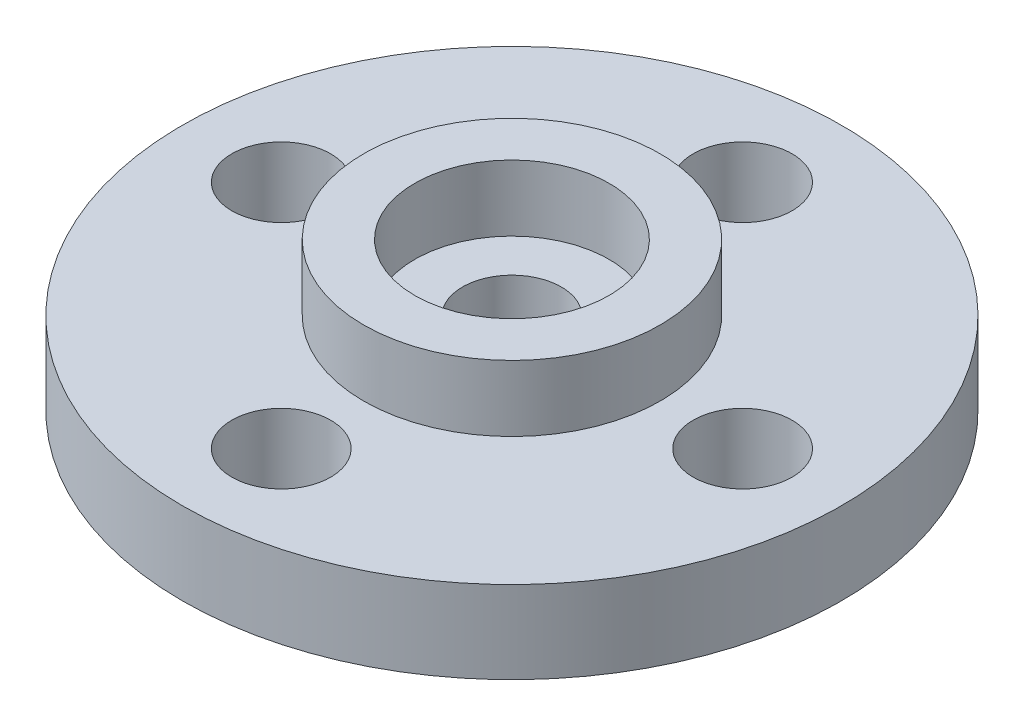
ISO-10303-21;
HEADER;
FILE_DESCRIPTION(('STEP AP214'),'2;1');
FILE_NAME('part.step','',(''),(''),'','','');
FILE_SCHEMA(('AUTOMOTIVE_DESIGN { 1 0 10303 214 1 1 1 1 }'));
ENDSEC;
DATA;
#1=APPLICATION_CONTEXT('core data for automotive mechanical design processes');
#2=APPLICATION_PROTOCOL_DEFINITION('international standard','automotive_design',2000,#1);
#3=PRODUCT_CONTEXT('',#1,'mechanical');
#4=PRODUCT('Part','Part','',(#3));
#5=PRODUCT_RELATED_PRODUCT_CATEGORY('part','',(#4));
#6=PRODUCT_DEFINITION_FORMATION('','',#4);
#7=PRODUCT_DEFINITION_CONTEXT('part definition',#1,'design');
#8=PRODUCT_DEFINITION('design','',#6,#7);
#9=PRODUCT_DEFINITION_SHAPE('','',#8);
#10=(LENGTH_UNIT() NAMED_UNIT(*) SI_UNIT(.MILLI.,.METRE.));
#11=(NAMED_UNIT(*) PLANE_ANGLE_UNIT() SI_UNIT($,.RADIAN.));
#12=(NAMED_UNIT(*) SI_UNIT($,.STERADIAN.) SOLID_ANGLE_UNIT());
#13=UNCERTAINTY_MEASURE_WITH_UNIT(LENGTH_MEASURE(1.E-05),#10,'distance_accuracy_value','');
#14=(GEOMETRIC_REPRESENTATION_CONTEXT(3) GLOBAL_UNCERTAINTY_ASSIGNED_CONTEXT((#13)) GLOBAL_UNIT_ASSIGNED_CONTEXT((#10,
#11,#12)) REPRESENTATION_CONTEXT('',''));
#15=CARTESIAN_POINT('',(0.,0.,0.));
#16=DIRECTION('',(0.,0.,1.));
#17=DIRECTION('',(1.,0.,0.));
#18=AXIS2_PLACEMENT_3D('',#15,#16,#17);
#19=CARTESIAN_POINT('',(0.,2.5,0.));
#20=DIRECTION('',(0.,1.,0.));
#21=DIRECTION('',(0.,0.,1.));
#22=AXIS2_PLACEMENT_3D('',#19,#20,#21);
#23=PLANE('',#22);
#24=CARTESIAN_POINT('',(0.,2.5,0.));
#25=DIRECTION('',(0.,1.,0.));
#26=DIRECTION('',(0.,0.,1.));
#27=AXIS2_PLACEMENT_3D('',#24,#25,#26);
#28=CIRCLE('',#27,1.5);
#29=CARTESIAN_POINT('',(0.,2.5,1.5));
#30=VERTEX_POINT('',#29);
#31=EDGE_CURVE('E53',#30,#30,#28,.T.);
#32=ORIENTED_EDGE('',*,*,#31,.F.);
#33=EDGE_LOOP('',(#32));
#34=FACE_BOUND('',#33,.T.);
#35=CARTESIAN_POINT('',(0.,2.5,0.));
#36=DIRECTION('',(0.,1.,0.));
#37=DIRECTION('',(0.,0.,1.));
#38=AXIS2_PLACEMENT_3D('',#35,#36,#37);
#39=CIRCLE('',#38,2.95);
#40=CARTESIAN_POINT('',(0.,2.5,2.95));
#41=VERTEX_POINT('',#40);
#42=EDGE_CURVE('E10',#41,#41,#39,.F.);
#43=ORIENTED_EDGE('',*,*,#42,.F.);
#44=EDGE_LOOP('',(#43));
#45=FACE_BOUND('',#44,.T.);
#46=ADVANCED_FACE('F37',(#34,#45),#23,.T.);
#47=CARTESIAN_POINT('',(0.,2.5,0.));
#48=DIRECTION('',(0.,1.,0.));
#49=DIRECTION('',(0.,0.,1.));
#50=AXIS2_PLACEMENT_3D('',#47,#48,#49);
#51=CIRCLE('',#50,4.5);
#52=CARTESIAN_POINT('',(0.,2.5,4.5));
#53=VERTEX_POINT('',#52);
#54=EDGE_CURVE('E85',#53,#53,#51,.T.);
#55=ORIENTED_EDGE('',*,*,#54,.F.);
#56=EDGE_LOOP('',(#55));
#57=FACE_BOUND('',#56,.T.);
#58=CARTESIAN_POINT('',(0.,2.5,7.00000000000009));
#59=DIRECTION('',(0.,1.,0.));
#60=DIRECTION('',(0.,0.,1.));
#61=AXIS2_PLACEMENT_3D('',#58,#59,#60);
#62=CIRCLE('',#61,1.5);
#63=CARTESIAN_POINT('',(0.,2.5,8.50000000000009));
#64=VERTEX_POINT('',#63);
#65=EDGE_CURVE('E70',#64,#64,#62,.T.);
#66=ORIENTED_EDGE('',*,*,#65,.F.);
#67=EDGE_LOOP('',(#66));
#68=FACE_BOUND('',#67,.T.);
#69=CARTESIAN_POINT('',(0.,2.5,-7.0000000000001));
#70=DIRECTION('',(0.,1.,0.));
#71=DIRECTION('',(0.,0.,1.));
#72=AXIS2_PLACEMENT_3D('',#69,#70,#71);
#73=CIRCLE('',#72,1.5);
#74=CARTESIAN_POINT('',(0.,2.5,-5.5000000000001));
#75=VERTEX_POINT('',#74);
#76=EDGE_CURVE('E58',#75,#75,#73,.T.);
#77=ORIENTED_EDGE('',*,*,#76,.F.);
#78=EDGE_LOOP('',(#77));
#79=FACE_BOUND('',#78,.T.);
#80=CARTESIAN_POINT('',(0.,2.5,0.));
#81=DIRECTION('',(0.,1.,0.));
#82=DIRECTION('',(0.,0.,1.));
#83=AXIS2_PLACEMENT_3D('',#80,#81,#82);
#84=CIRCLE('',#83,10.);
#85=CARTESIAN_POINT('',(0.,2.5,10.));
#86=VERTEX_POINT('',#85);
#87=EDGE_CURVE('E44',#86,#86,#84,.T.);
#88=ORIENTED_EDGE('',*,*,#87,.T.);
#89=EDGE_LOOP('',(#88));
#90=FACE_BOUND('',#89,.T.);
#91=CARTESIAN_POINT('',(7.0000000000001,2.5,0.));
#92=DIRECTION('',(0.,1.,0.));
#93=DIRECTION('',(0.,0.,1.));
#94=AXIS2_PLACEMENT_3D('',#91,#92,#93);
#95=CIRCLE('',#94,1.5);
#96=CARTESIAN_POINT('',(7.0000000000001,2.5,1.5));
#97=VERTEX_POINT('',#96);
#98=EDGE_CURVE('E64',#97,#97,#95,.T.);
#99=ORIENTED_EDGE('',*,*,#98,.F.);
#100=EDGE_LOOP('',(#99));
#101=FACE_BOUND('',#100,.T.);
#102=CARTESIAN_POINT('',(-7.0000000000001,2.5,0.));
#103=DIRECTION('',(0.,1.,0.));
#104=DIRECTION('',(0.,0.,1.));
#105=AXIS2_PLACEMENT_3D('',#102,#103,#104);
#106=CIRCLE('',#105,1.5);
#107=CARTESIAN_POINT('',(-7.0000000000001,2.5,1.5));
#108=VERTEX_POINT('',#107);
#109=EDGE_CURVE('E76',#108,#108,#106,.T.);
#110=ORIENTED_EDGE('',*,*,#109,.F.);
#111=EDGE_LOOP('',(#110));
#112=FACE_BOUND('',#111,.T.);
#113=ADVANCED_FACE('F113',(#57,#68,#79,#90,#101,#112),#23,.T.);
#114=CARTESIAN_POINT('',(0.,0.,0.));
#115=DIRECTION('',(0.,1.,0.));
#116=DIRECTION('',(0.,0.,1.));
#117=AXIS2_PLACEMENT_3D('',#114,#115,#116);
#118=PLANE('',#117);
#119=CARTESIAN_POINT('',(0.,0.,0.));
#120=DIRECTION('',(0.,1.,0.));
#121=DIRECTION('',(0.,0.,1.));
#122=AXIS2_PLACEMENT_3D('',#119,#120,#121);
#123=CIRCLE('',#122,10.);
#124=CARTESIAN_POINT('',(0.,0.,10.));
#125=VERTEX_POINT('',#124);
#126=EDGE_CURVE('E48',#125,#125,#123,.T.);
#127=ORIENTED_EDGE('',*,*,#126,.F.);
#128=EDGE_LOOP('',(#127));
#129=FACE_BOUND('',#128,.T.);
#130=CARTESIAN_POINT('',(0.,0.,0.));
#131=DIRECTION('',(0.,1.,0.));
#132=DIRECTION('',(0.,0.,1.));
#133=AXIS2_PLACEMENT_3D('',#130,#131,#132);
#134=CIRCLE('',#133,1.5);
#135=CARTESIAN_POINT('',(0.,0.,1.5));
#136=VERTEX_POINT('',#135);
#137=EDGE_CURVE('E55',#136,#136,#134,.T.);
#138=ORIENTED_EDGE('',*,*,#137,.T.);
#139=EDGE_LOOP('',(#138));
#140=FACE_BOUND('',#139,.T.);
#141=CARTESIAN_POINT('',(0.,0.,-7.0000000000001));
#142=DIRECTION('',(0.,1.,0.));
#143=DIRECTION('',(0.,0.,1.));
#144=AXIS2_PLACEMENT_3D('',#141,#142,#143);
#145=CIRCLE('',#144,1.5);
#146=CARTESIAN_POINT('',(0.,0.,-5.5000000000001));
#147=VERTEX_POINT('',#146);
#148=EDGE_CURVE('E61',#147,#147,#145,.T.);
#149=ORIENTED_EDGE('',*,*,#148,.T.);
#150=EDGE_LOOP('',(#149));
#151=FACE_BOUND('',#150,.T.);
#152=CARTESIAN_POINT('',(7.0000000000001,0.,0.));
#153=DIRECTION('',(0.,1.,0.));
#154=DIRECTION('',(0.,0.,1.));
#155=AXIS2_PLACEMENT_3D('',#152,#153,#154);
#156=CIRCLE('',#155,1.5);
#157=CARTESIAN_POINT('',(7.0000000000001,0.,1.5));
#158=VERTEX_POINT('',#157);
#159=EDGE_CURVE('E67',#158,#158,#156,.T.);
#160=ORIENTED_EDGE('',*,*,#159,.T.);
#161=EDGE_LOOP('',(#160));
#162=FACE_BOUND('',#161,.T.);
#163=CARTESIAN_POINT('',(0.,0.,7.00000000000009));
#164=DIRECTION('',(0.,1.,0.));
#165=DIRECTION('',(0.,0.,1.));
#166=AXIS2_PLACEMENT_3D('',#163,#164,#165);
#167=CIRCLE('',#166,1.5);
#168=CARTESIAN_POINT('',(0.,0.,8.50000000000009));
#169=VERTEX_POINT('',#168);
#170=EDGE_CURVE('E73',#169,#169,#167,.T.);
#171=ORIENTED_EDGE('',*,*,#170,.T.);
#172=EDGE_LOOP('',(#171));
#173=FACE_BOUND('',#172,.T.);
#174=CARTESIAN_POINT('',(-7.0000000000001,0.,0.));
#175=DIRECTION('',(0.,1.,0.));
#176=DIRECTION('',(0.,0.,1.));
#177=AXIS2_PLACEMENT_3D('',#174,#175,#176);
#178=CIRCLE('',#177,1.5);
#179=CARTESIAN_POINT('',(-7.0000000000001,0.,1.5));
#180=VERTEX_POINT('',#179);
#181=EDGE_CURVE('E79',#180,#180,#178,.T.);
#182=ORIENTED_EDGE('',*,*,#181,.T.);
#183=EDGE_LOOP('',(#182));
#184=FACE_BOUND('',#183,.T.);
#185=ADVANCED_FACE('F119',(#129,#140,#151,#162,#173,#184),#118,.F.);
#186=CARTESIAN_POINT('',(0.,2.5,0.));
#187=DIRECTION('',(0.,-1.,0.));
#188=DIRECTION('',(0.,0.,-1.));
#189=AXIS2_PLACEMENT_3D('',#186,#187,#188);
#190=CYLINDRICAL_SURFACE('',#189,10.);
#191=ORIENTED_EDGE('',*,*,#87,.F.);
#192=EDGE_LOOP('',(#191));
#193=FACE_BOUND('',#192,.T.);
#194=ORIENTED_EDGE('',*,*,#126,.T.);
#195=EDGE_LOOP('',(#194));
#196=FACE_BOUND('',#195,.T.);
#197=ADVANCED_FACE('F39',(#193,#196),#190,.T.);
#198=CARTESIAN_POINT('',(0.,2.5,0.));
#199=DIRECTION('',(0.,-1.,0.));
#200=DIRECTION('',(0.,0.,-1.));
#201=AXIS2_PLACEMENT_3D('',#198,#199,#200);
#202=CYLINDRICAL_SURFACE('',#201,1.5);
#203=ORIENTED_EDGE('',*,*,#31,.T.);
#204=EDGE_LOOP('',(#203));
#205=FACE_BOUND('',#204,.T.);
#206=ORIENTED_EDGE('',*,*,#137,.F.);
#207=EDGE_LOOP('',(#206));
#208=FACE_BOUND('',#207,.T.);
#209=ADVANCED_FACE('F124',(#205,#208),#202,.F.);
#210=CARTESIAN_POINT('',(0.,2.5,-7.0000000000001));
#211=DIRECTION('',(0.,-1.,0.));
#212=DIRECTION('',(0.,0.,-1.));
#213=AXIS2_PLACEMENT_3D('',#210,#211,#212);
#214=CYLINDRICAL_SURFACE('',#213,1.5);
#215=ORIENTED_EDGE('',*,*,#76,.T.);
#216=EDGE_LOOP('',(#215));
#217=FACE_BOUND('',#216,.T.);
#218=ORIENTED_EDGE('',*,*,#148,.F.);
#219=EDGE_LOOP('',(#218));
#220=FACE_BOUND('',#219,.T.);
#221=ADVANCED_FACE('F152',(#217,#220),#214,.F.);
#222=CARTESIAN_POINT('',(7.0000000000001,2.5,0.));
#223=DIRECTION('',(0.,-1.,0.));
#224=DIRECTION('',(0.,0.,-1.));
#225=AXIS2_PLACEMENT_3D('',#222,#223,#224);
#226=CYLINDRICAL_SURFACE('',#225,1.5);
#227=ORIENTED_EDGE('',*,*,#98,.T.);
#228=EDGE_LOOP('',(#227));
#229=FACE_BOUND('',#228,.T.);
#230=ORIENTED_EDGE('',*,*,#159,.F.);
#231=EDGE_LOOP('',(#230));
#232=FACE_BOUND('',#231,.T.);
#233=ADVANCED_FACE('F146',(#229,#232),#226,.F.);
#234=CARTESIAN_POINT('',(0.,2.5,7.00000000000009));
#235=DIRECTION('',(0.,-1.,0.));
#236=DIRECTION('',(0.,0.,-1.));
#237=AXIS2_PLACEMENT_3D('',#234,#235,#236);
#238=CYLINDRICAL_SURFACE('',#237,1.5);
#239=ORIENTED_EDGE('',*,*,#65,.T.);
#240=EDGE_LOOP('',(#239));
#241=FACE_BOUND('',#240,.T.);
#242=ORIENTED_EDGE('',*,*,#170,.F.);
#243=EDGE_LOOP('',(#242));
#244=FACE_BOUND('',#243,.T.);
#245=ADVANCED_FACE('F108',(#241,#244),#238,.F.);
#246=CARTESIAN_POINT('',(-7.0000000000001,2.5,0.));
#247=DIRECTION('',(0.,-1.,0.));
#248=DIRECTION('',(0.,0.,-1.));
#249=AXIS2_PLACEMENT_3D('',#246,#247,#248);
#250=CYLINDRICAL_SURFACE('',#249,1.5);
#251=ORIENTED_EDGE('',*,*,#109,.T.);
#252=EDGE_LOOP('',(#251));
#253=FACE_BOUND('',#252,.T.);
#254=ORIENTED_EDGE('',*,*,#181,.F.);
#255=EDGE_LOOP('',(#254));
#256=FACE_BOUND('',#255,.T.);
#257=ADVANCED_FACE('F99',(#253,#256),#250,.F.);
#258=CARTESIAN_POINT('',(0.,4.5,0.));
#259=DIRECTION('',(0.,1.,0.));
#260=DIRECTION('',(0.,0.,1.));
#261=AXIS2_PLACEMENT_3D('',#258,#259,#260);
#262=PLANE('',#261);
#263=CARTESIAN_POINT('',(0.,4.5,0.));
#264=DIRECTION('',(0.,1.,0.));
#265=DIRECTION('',(0.,0.,1.));
#266=AXIS2_PLACEMENT_3D('',#263,#264,#265);
#267=CIRCLE('',#266,4.5);
#268=CARTESIAN_POINT('',(0.,4.5,4.5));
#269=VERTEX_POINT('',#268);
#270=EDGE_CURVE('E82',#269,#269,#267,.T.);
#271=ORIENTED_EDGE('',*,*,#270,.T.);
#272=EDGE_LOOP('',(#271));
#273=FACE_BOUND('',#272,.T.);
#274=CARTESIAN_POINT('',(0.,4.5,0.));
#275=DIRECTION('',(0.,1.,0.));
#276=DIRECTION('',(0.,0.,1.));
#277=AXIS2_PLACEMENT_3D('',#274,#275,#276);
#278=CIRCLE('',#277,2.95);
#279=CARTESIAN_POINT('',(0.,4.5,2.95));
#280=VERTEX_POINT('',#279);
#281=EDGE_CURVE('E88',#280,#280,#278,.T.);
#282=ORIENTED_EDGE('',*,*,#281,.F.);
#283=EDGE_LOOP('',(#282));
#284=FACE_BOUND('',#283,.T.);
#285=ADVANCED_FACE('F96',(#273,#284),#262,.T.);
#286=CARTESIAN_POINT('',(0.,4.5,0.));
#287=DIRECTION('',(0.,-1.,0.));
#288=DIRECTION('',(0.,0.,-1.));
#289=AXIS2_PLACEMENT_3D('',#286,#287,#288);
#290=CYLINDRICAL_SURFACE('',#289,4.5);
#291=ORIENTED_EDGE('',*,*,#270,.F.);
#292=EDGE_LOOP('',(#291));
#293=FACE_BOUND('',#292,.T.);
#294=ORIENTED_EDGE('',*,*,#54,.T.);
#295=EDGE_LOOP('',(#294));
#296=FACE_BOUND('',#295,.T.);
#297=ADVANCED_FACE('F98',(#293,#296),#290,.T.);
#298=CARTESIAN_POINT('',(0.,4.5,0.));
#299=DIRECTION('',(0.,-1.,0.));
#300=DIRECTION('',(0.,0.,-1.));
#301=AXIS2_PLACEMENT_3D('',#298,#299,#300);
#302=CYLINDRICAL_SURFACE('',#301,2.95);
#303=ORIENTED_EDGE('',*,*,#281,.T.);
#304=EDGE_LOOP('',(#303));
#305=FACE_BOUND('',#304,.T.);
#306=ORIENTED_EDGE('',*,*,#42,.T.);
#307=EDGE_LOOP('',(#306));
#308=FACE_BOUND('',#307,.T.);
#309=ADVANCED_FACE('F94',(#305,#308),#302,.F.);
#310=CLOSED_SHELL('',(#46,#113,#185,#197,#209,#221,#233,#245,#257,#285,#297,#309));
#311=MANIFOLD_SOLID_BREP('B2',#310);
#312=ADVANCED_BREP_SHAPE_REPRESENTATION('',(#18,#311),#14);
#313=SHAPE_DEFINITION_REPRESENTATION(#9,#312);
ENDSEC;
END-ISO-10303-21;
